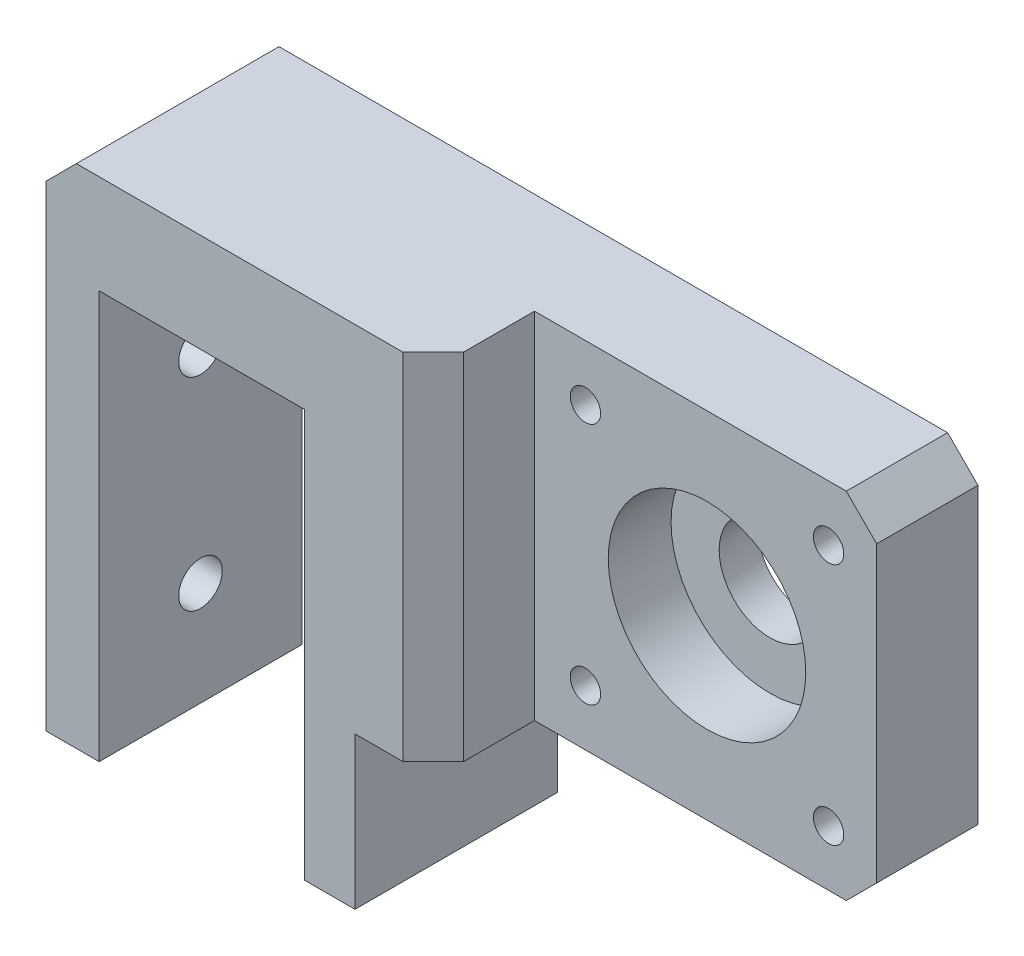
ISO-10303-21;
HEADER;
FILE_DESCRIPTION(('STEP AP214'),'2;1');
FILE_NAME('part.step','',(''),(''),'','','');
FILE_SCHEMA(('AUTOMOTIVE_DESIGN { 1 0 10303 214 1 1 1 1 }'));
ENDSEC;
DATA;
#1=APPLICATION_CONTEXT('core data for automotive mechanical design processes');
#2=APPLICATION_PROTOCOL_DEFINITION('international standard','automotive_design',2000,#1);
#3=PRODUCT_CONTEXT('',#1,'mechanical');
#4=PRODUCT('Part','Part','',(#3));
#5=PRODUCT_RELATED_PRODUCT_CATEGORY('part','',(#4));
#6=PRODUCT_DEFINITION_FORMATION('','',#4);
#7=PRODUCT_DEFINITION_CONTEXT('part definition',#1,'design');
#8=PRODUCT_DEFINITION('design','',#6,#7);
#9=PRODUCT_DEFINITION_SHAPE('','',#8);
#10=(LENGTH_UNIT() NAMED_UNIT(*) SI_UNIT(.MILLI.,.METRE.));
#11=(NAMED_UNIT(*) PLANE_ANGLE_UNIT() SI_UNIT($,.RADIAN.));
#12=(NAMED_UNIT(*) SI_UNIT($,.STERADIAN.) SOLID_ANGLE_UNIT());
#13=UNCERTAINTY_MEASURE_WITH_UNIT(LENGTH_MEASURE(1.E-05),#10,'distance_accuracy_value','');
#14=(GEOMETRIC_REPRESENTATION_CONTEXT(3) GLOBAL_UNCERTAINTY_ASSIGNED_CONTEXT((#13)) GLOBAL_UNIT_ASSIGNED_CONTEXT((#10,
#11,#12)) REPRESENTATION_CONTEXT('',''));
#15=CARTESIAN_POINT('',(0.,0.,0.));
#16=DIRECTION('',(0.,0.,1.));
#17=DIRECTION('',(1.,0.,0.));
#18=AXIS2_PLACEMENT_3D('',#15,#16,#17);
#19=CARTESIAN_POINT('',(55.25,32.5,20.));
#20=DIRECTION('',(0.,0.,1.));
#21=DIRECTION('',(-1.,0.,0.));
#22=AXIS2_PLACEMENT_3D('',#19,#20,#21);
#23=CYLINDRICAL_SURFACE('',#22,5.);
#24=CARTESIAN_POINT('',(55.25,32.5,20.));
#25=DIRECTION('',(0.,0.,1.));
#26=DIRECTION('',(1.,0.,0.));
#27=AXIS2_PLACEMENT_3D('',#24,#25,#26);
#28=CIRCLE('',#27,5.);
#29=CARTESIAN_POINT('',(60.25,32.5,20.));
#30=VERTEX_POINT('',#29);
#31=EDGE_CURVE('E283',#30,#30,#28,.T.);
#32=ORIENTED_EDGE('',*,*,#31,.F.);
#33=EDGE_LOOP('',(#32));
#34=FACE_BOUND('',#33,.T.);
#35=CARTESIAN_POINT('',(55.25,32.5,23.8));
#36=DIRECTION('',(0.,0.,-1.));
#37=DIRECTION('',(-1.,0.,0.));
#38=AXIS2_PLACEMENT_3D('',#35,#36,#37);
#39=CIRCLE('',#38,5.);
#40=CARTESIAN_POINT('',(50.25,32.5,23.8));
#41=VERTEX_POINT('',#40);
#42=EDGE_CURVE('E211',#41,#41,#39,.T.);
#43=ORIENTED_EDGE('',*,*,#42,.F.);
#44=EDGE_LOOP('',(#43));
#45=FACE_BOUND('',#44,.T.);
#46=ADVANCED_FACE('F45',(#34,#45),#23,.F.);
#47=CARTESIAN_POINT('',(72.,50.,20.));
#48=DIRECTION('',(-1.,0.,0.));
#49=DIRECTION('',(0.,0.,-1.));
#50=AXIS2_PLACEMENT_3D('',#47,#48,#49);
#51=PLANE('',#50);
#52=DIRECTION('',(0.,1.,0.));
#53=VECTOR('',#52,1.);
#54=CARTESIAN_POINT('',(72.,50.,20.));
#55=LINE('',#54,#53);
#56=CARTESIAN_POINT('',(72.,18.,20.));
#57=VERTEX_POINT('',#56);
#58=CARTESIAN_POINT('',(72.,47.,20.));
#59=VERTEX_POINT('',#58);
#60=EDGE_CURVE('E302',#57,#59,#55,.T.);
#61=ORIENTED_EDGE('',*,*,#60,.T.);
#62=DIRECTION('',(0.,0.,-1.));
#63=VECTOR('',#62,1.);
#64=CARTESIAN_POINT('',(72.,47.,20.));
#65=LINE('',#64,#63);
#66=CARTESIAN_POINT('',(72.,46.9999999999999,30.));
#67=VERTEX_POINT('',#66);
#68=EDGE_CURVE('E397',#67,#59,#65,.T.);
#69=ORIENTED_EDGE('',*,*,#68,.F.);
#70=DIRECTION('',(0.,-1.,0.));
#71=VECTOR('',#70,1.);
#72=CARTESIAN_POINT('',(72.,50.,30.));
#73=LINE('',#72,#71);
#74=CARTESIAN_POINT('',(72.,18.,30.));
#75=VERTEX_POINT('',#74);
#76=EDGE_CURVE('E215',#67,#75,#73,.T.);
#77=ORIENTED_EDGE('',*,*,#76,.T.);
#78=DIRECTION('',(0.,0.,1.));
#79=VECTOR('',#78,1.);
#80=CARTESIAN_POINT('',(72.,18.,20.));
#81=LINE('',#80,#79);
#82=EDGE_CURVE('E401',#57,#75,#81,.T.);
#83=ORIENTED_EDGE('',*,*,#82,.F.);
#84=EDGE_LOOP('',(#61,#69,#77,#83));
#85=FACE_BOUND('',#84,.T.);
#86=ADVANCED_FACE('F415',(#85),#51,.F.);
#87=CARTESIAN_POINT('',(67.25,44.5,20.));
#88=DIRECTION('',(0.,0.,1.));
#89=DIRECTION('',(-1.,0.,0.));
#90=AXIS2_PLACEMENT_3D('',#87,#88,#89);
#91=CYLINDRICAL_SURFACE('',#90,1.5);
#92=CARTESIAN_POINT('',(67.25,44.5,20.));
#93=DIRECTION('',(0.,0.,1.));
#94=DIRECTION('',(1.,0.,0.));
#95=AXIS2_PLACEMENT_3D('',#92,#93,#94);
#96=CIRCLE('',#95,1.5);
#97=CARTESIAN_POINT('',(68.75,44.5,20.));
#98=VERTEX_POINT('',#97);
#99=EDGE_CURVE('E279',#98,#98,#96,.T.);
#100=ORIENTED_EDGE('',*,*,#99,.F.);
#101=EDGE_LOOP('',(#100));
#102=FACE_BOUND('',#101,.T.);
#103=CARTESIAN_POINT('',(67.25,44.5,30.));
#104=DIRECTION('',(0.,0.,-1.));
#105=DIRECTION('',(-1.,0.,0.));
#106=AXIS2_PLACEMENT_3D('',#103,#104,#105);
#107=CIRCLE('',#106,1.5);
#108=CARTESIAN_POINT('',(65.75,44.5,30.));
#109=VERTEX_POINT('',#108);
#110=EDGE_CURVE('E247',#109,#109,#107,.T.);
#111=ORIENTED_EDGE('',*,*,#110,.F.);
#112=EDGE_LOOP('',(#111));
#113=FACE_BOUND('',#112,.T.);
#114=ADVANCED_FACE('F450',(#102,#113),#91,.F.);
#115=CARTESIAN_POINT('',(43.25,44.5,20.));
#116=DIRECTION('',(0.,0.,1.));
#117=DIRECTION('',(-1.,0.,0.));
#118=AXIS2_PLACEMENT_3D('',#115,#116,#117);
#119=CYLINDRICAL_SURFACE('',#118,1.5);
#120=CARTESIAN_POINT('',(43.25,44.5,20.));
#121=DIRECTION('',(0.,0.,1.));
#122=DIRECTION('',(1.,0.,0.));
#123=AXIS2_PLACEMENT_3D('',#120,#121,#122);
#124=CIRCLE('',#123,1.5);
#125=CARTESIAN_POINT('',(44.75,44.5,20.));
#126=VERTEX_POINT('',#125);
#127=EDGE_CURVE('E275',#126,#126,#124,.T.);
#128=ORIENTED_EDGE('',*,*,#127,.F.);
#129=EDGE_LOOP('',(#128));
#130=FACE_BOUND('',#129,.T.);
#131=CARTESIAN_POINT('',(43.25,44.5,30.));
#132=DIRECTION('',(0.,0.,-1.));
#133=DIRECTION('',(-1.,0.,0.));
#134=AXIS2_PLACEMENT_3D('',#131,#132,#133);
#135=CIRCLE('',#134,1.5);
#136=CARTESIAN_POINT('',(41.75,44.5,30.));
#137=VERTEX_POINT('',#136);
#138=EDGE_CURVE('E243',#137,#137,#135,.T.);
#139=ORIENTED_EDGE('',*,*,#138,.F.);
#140=EDGE_LOOP('',(#139));
#141=FACE_BOUND('',#140,.T.);
#142=ADVANCED_FACE('F541',(#130,#141),#119,.F.);
#143=CARTESIAN_POINT('',(43.25,20.5,20.));
#144=DIRECTION('',(0.,0.,1.));
#145=DIRECTION('',(-1.,0.,0.));
#146=AXIS2_PLACEMENT_3D('',#143,#144,#145);
#147=CYLINDRICAL_SURFACE('',#146,1.5);
#148=CARTESIAN_POINT('',(43.25,20.5,20.));
#149=DIRECTION('',(0.,0.,1.));
#150=DIRECTION('',(1.,0.,0.));
#151=AXIS2_PLACEMENT_3D('',#148,#149,#150);
#152=CIRCLE('',#151,1.5);
#153=CARTESIAN_POINT('',(44.75,20.5,20.));
#154=VERTEX_POINT('',#153);
#155=EDGE_CURVE('E271',#154,#154,#152,.T.);
#156=ORIENTED_EDGE('',*,*,#155,.F.);
#157=EDGE_LOOP('',(#156));
#158=FACE_BOUND('',#157,.T.);
#159=CARTESIAN_POINT('',(43.25,20.5,30.));
#160=DIRECTION('',(0.,0.,-1.));
#161=DIRECTION('',(-1.,0.,0.));
#162=AXIS2_PLACEMENT_3D('',#159,#160,#161);
#163=CIRCLE('',#162,1.5);
#164=CARTESIAN_POINT('',(41.75,20.5,30.));
#165=VERTEX_POINT('',#164);
#166=EDGE_CURVE('E239',#165,#165,#163,.T.);
#167=ORIENTED_EDGE('',*,*,#166,.F.);
#168=EDGE_LOOP('',(#167));
#169=FACE_BOUND('',#168,.T.);
#170=ADVANCED_FACE('F538',(#158,#169),#147,.F.);
#171=CARTESIAN_POINT('',(67.25,20.5,20.));
#172=DIRECTION('',(0.,0.,1.));
#173=DIRECTION('',(-1.,0.,0.));
#174=AXIS2_PLACEMENT_3D('',#171,#172,#173);
#175=CYLINDRICAL_SURFACE('',#174,1.5);
#176=CARTESIAN_POINT('',(67.25,20.5,20.));
#177=DIRECTION('',(0.,0.,1.));
#178=DIRECTION('',(1.,0.,0.));
#179=AXIS2_PLACEMENT_3D('',#176,#177,#178);
#180=CIRCLE('',#179,1.5);
#181=CARTESIAN_POINT('',(68.75,20.5,20.));
#182=VERTEX_POINT('',#181);
#183=EDGE_CURVE('E264',#182,#182,#180,.T.);
#184=ORIENTED_EDGE('',*,*,#183,.F.);
#185=EDGE_LOOP('',(#184));
#186=FACE_BOUND('',#185,.T.);
#187=CARTESIAN_POINT('',(67.25,20.5,30.));
#188=DIRECTION('',(0.,0.,-1.));
#189=DIRECTION('',(-1.,0.,0.));
#190=AXIS2_PLACEMENT_3D('',#187,#188,#189);
#191=CIRCLE('',#190,1.5);
#192=CARTESIAN_POINT('',(65.75,20.5,30.));
#193=VERTEX_POINT('',#192);
#194=EDGE_CURVE('E235',#193,#193,#191,.T.);
#195=ORIENTED_EDGE('',*,*,#194,.F.);
#196=EDGE_LOOP('',(#195));
#197=FACE_BOUND('',#196,.T.);
#198=ADVANCED_FACE('F460',(#186,#197),#175,.F.);
#199=CARTESIAN_POINT('',(0.,0.,20.));
#200=DIRECTION('',(0.,0.,1.));
#201=DIRECTION('',(-1.,0.,0.));
#202=AXIS2_PLACEMENT_3D('',#199,#200,#201);
#203=PLANE('',#202);
#204=DIRECTION('',(-1.,0.,0.));
#205=VECTOR('',#204,1.);
#206=CARTESIAN_POINT('',(0.,50.,20.));
#207=LINE('',#206,#205);
#208=CARTESIAN_POINT('',(68.9999999999999,50.,20.));
#209=VERTEX_POINT('',#208);
#210=CARTESIAN_POINT('',(3.,50.,20.));
#211=VERTEX_POINT('',#210);
#212=EDGE_CURVE('E306',#209,#211,#207,.T.);
#213=ORIENTED_EDGE('',*,*,#212,.F.);
#214=DIRECTION('',(0.707106781186546,-0.707106781186549,0.));
#215=VECTOR('',#214,1.);
#216=CARTESIAN_POINT('',(68.9999999999999,50.,20.));
#217=LINE('',#216,#215);
#218=EDGE_CURVE('E376',#59,#209,#217,.F.);
#219=ORIENTED_EDGE('',*,*,#218,.F.);
#220=ORIENTED_EDGE('',*,*,#60,.F.);
#221=DIRECTION('',(-0.707106781186548,-0.707106781186548,0.));
#222=VECTOR('',#221,1.);
#223=CARTESIAN_POINT('',(72.,18.,20.));
#224=LINE('',#223,#222);
#225=CARTESIAN_POINT('',(69.,15.,20.));
#226=VERTEX_POINT('',#225);
#227=EDGE_CURVE('E380',#226,#57,#224,.F.);
#228=ORIENTED_EDGE('',*,*,#227,.F.);
#229=DIRECTION('',(1.,0.,0.));
#230=VECTOR('',#229,1.);
#231=CARTESIAN_POINT('',(72.,15.,20.));
#232=LINE('',#231,#230);
#233=CARTESIAN_POINT('',(30.5,15.,20.));
#234=VERTEX_POINT('',#233);
#235=EDGE_CURVE('E298',#234,#226,#232,.T.);
#236=ORIENTED_EDGE('',*,*,#235,.F.);
#237=DIRECTION('',(0.,1.,0.));
#238=VECTOR('',#237,1.);
#239=CARTESIAN_POINT('',(30.5,15.,20.));
#240=LINE('',#239,#238);
#241=CARTESIAN_POINT('',(30.5,0.,20.));
#242=VERTEX_POINT('',#241);
#243=EDGE_CURVE('E294',#242,#234,#240,.T.);
#244=ORIENTED_EDGE('',*,*,#243,.F.);
#245=DIRECTION('',(1.,0.,0.));
#246=VECTOR('',#245,1.);
#247=CARTESIAN_POINT('',(30.5,0.,20.));
#248=LINE('',#247,#246);
#249=CARTESIAN_POINT('',(25.5,0.,20.));
#250=VERTEX_POINT('',#249);
#251=EDGE_CURVE('E290',#250,#242,#248,.T.);
#252=ORIENTED_EDGE('',*,*,#251,.F.);
#253=DIRECTION('',(0.,-1.,0.));
#254=VECTOR('',#253,1.);
#255=CARTESIAN_POINT('',(25.5,40.5,20.));
#256=LINE('',#255,#254);
#257=CARTESIAN_POINT('',(25.5,40.25,20.));
#258=VERTEX_POINT('',#257);
#259=EDGE_CURVE('E167',#258,#250,#256,.T.);
#260=ORIENTED_EDGE('',*,*,#259,.F.);
#261=DIRECTION('',(1.,0.,0.));
#262=VECTOR('',#261,1.);
#263=CARTESIAN_POINT('',(5.,40.25,20.));
#264=LINE('',#263,#262);
#265=CARTESIAN_POINT('',(5.25000000000003,40.25,20.));
#266=VERTEX_POINT('',#265);
#267=EDGE_CURVE('E176',#266,#258,#264,.T.);
#268=ORIENTED_EDGE('',*,*,#267,.F.);
#269=DIRECTION('',(0.,1.,0.));
#270=VECTOR('',#269,1.);
#271=CARTESIAN_POINT('',(5.24999999999998,0.,20.));
#272=LINE('',#271,#270);
#273=CARTESIAN_POINT('',(5.24999999999998,0.,20.));
#274=VERTEX_POINT('',#273);
#275=EDGE_CURVE('E171',#274,#266,#272,.T.);
#276=ORIENTED_EDGE('',*,*,#275,.F.);
#277=DIRECTION('',(1.,0.,0.));
#278=VECTOR('',#277,1.);
#279=CARTESIAN_POINT('',(5.,0.,20.));
#280=LINE('',#279,#278);
#281=CARTESIAN_POINT('',(0.,0.,20.));
#282=VERTEX_POINT('',#281);
#283=EDGE_CURVE('E156',#282,#274,#280,.T.);
#284=ORIENTED_EDGE('',*,*,#283,.F.);
#285=DIRECTION('',(0.,-1.,0.));
#286=VECTOR('',#285,1.);
#287=CARTESIAN_POINT('',(0.,0.,20.));
#288=LINE('',#287,#286);
#289=CARTESIAN_POINT('',(0.,47.,20.));
#290=VERTEX_POINT('',#289);
#291=EDGE_CURVE('E310',#290,#282,#288,.T.);
#292=ORIENTED_EDGE('',*,*,#291,.F.);
#293=DIRECTION('',(0.707106781186549,0.707106781186546,0.));
#294=VECTOR('',#293,1.);
#295=CARTESIAN_POINT('',(0.,47.,20.));
#296=LINE('',#295,#294);
#297=EDGE_CURVE('E383',#211,#290,#296,.F.);
#298=ORIENTED_EDGE('',*,*,#297,.F.);
#299=EDGE_LOOP('',(#213,#219,#220,#228,#236,#244,#252,#260,#268,#276,#284,#292,#298));
#300=FACE_BOUND('',#299,.T.);
#301=ORIENTED_EDGE('',*,*,#31,.T.);
#302=EDGE_LOOP('',(#301));
#303=FACE_BOUND('',#302,.T.);
#304=ORIENTED_EDGE('',*,*,#99,.T.);
#305=EDGE_LOOP('',(#304));
#306=FACE_BOUND('',#305,.T.);
#307=ORIENTED_EDGE('',*,*,#127,.T.);
#308=EDGE_LOOP('',(#307));
#309=FACE_BOUND('',#308,.T.);
#310=ORIENTED_EDGE('',*,*,#155,.T.);
#311=EDGE_LOOP('',(#310));
#312=FACE_BOUND('',#311,.T.);
#313=ORIENTED_EDGE('',*,*,#183,.T.);
#314=EDGE_LOOP('',(#313));
#315=FACE_BOUND('',#314,.T.);
#316=ADVANCED_FACE('F173',(#300,#303,#306,#309,#312,#315),#203,.F.);
#317=CARTESIAN_POINT('',(0.,0.,40.));
#318=DIRECTION('',(0.,0.,1.));
#319=DIRECTION('',(-1.,0.,0.));
#320=AXIS2_PLACEMENT_3D('',#317,#318,#319);
#321=PLANE('',#320);
#322=DIRECTION('',(0.,-1.,0.));
#323=VECTOR('',#322,1.);
#324=CARTESIAN_POINT('',(0.,0.,40.));
#325=LINE('',#324,#323);
#326=CARTESIAN_POINT('',(0.,47.,40.));
#327=VERTEX_POINT('',#326);
#328=CARTESIAN_POINT('',(0.,0.,40.));
#329=VERTEX_POINT('',#328);
#330=EDGE_CURVE('E168',#327,#329,#325,.T.);
#331=ORIENTED_EDGE('',*,*,#330,.T.);
#332=DIRECTION('',(1.,0.,0.));
#333=VECTOR('',#332,1.);
#334=CARTESIAN_POINT('',(4.99999999999995,0.,40.));
#335=LINE('',#334,#333);
#336=CARTESIAN_POINT('',(5.24999999999998,0.,40.));
#337=VERTEX_POINT('',#336);
#338=EDGE_CURVE('E286',#329,#337,#335,.T.);
#339=ORIENTED_EDGE('',*,*,#338,.T.);
#340=DIRECTION('',(0.,-1.,0.));
#341=VECTOR('',#340,1.);
#342=CARTESIAN_POINT('',(5.24999999999998,40.25,40.));
#343=LINE('',#342,#341);
#344=CARTESIAN_POINT('',(5.24999999999998,40.25,40.));
#345=VERTEX_POINT('',#344);
#346=EDGE_CURVE('E184',#345,#337,#343,.T.);
#347=ORIENTED_EDGE('',*,*,#346,.F.);
#348=DIRECTION('',(-1.,0.,0.));
#349=VECTOR('',#348,1.);
#350=CARTESIAN_POINT('',(25.5,40.25,40.));
#351=LINE('',#350,#349);
#352=CARTESIAN_POINT('',(25.5,40.25,40.));
#353=VERTEX_POINT('',#352);
#354=EDGE_CURVE('E66',#353,#345,#351,.T.);
#355=ORIENTED_EDGE('',*,*,#354,.F.);
#356=DIRECTION('',(0.,-1.,0.));
#357=VECTOR('',#356,1.);
#358=CARTESIAN_POINT('',(25.5,40.5,40.));
#359=LINE('',#358,#357);
#360=CARTESIAN_POINT('',(25.5,0.,40.));
#361=VERTEX_POINT('',#360);
#362=EDGE_CURVE('E315',#353,#361,#359,.T.);
#363=ORIENTED_EDGE('',*,*,#362,.T.);
#364=DIRECTION('',(1.,0.,0.));
#365=VECTOR('',#364,1.);
#366=CARTESIAN_POINT('',(30.5,0.,40.));
#367=LINE('',#366,#365);
#368=CARTESIAN_POINT('',(30.5,0.,40.));
#369=VERTEX_POINT('',#368);
#370=EDGE_CURVE('E318',#361,#369,#367,.T.);
#371=ORIENTED_EDGE('',*,*,#370,.T.);
#372=DIRECTION('',(0.,1.,0.));
#373=VECTOR('',#372,1.);
#374=CARTESIAN_POINT('',(30.5,15.,40.));
#375=LINE('',#374,#373);
#376=CARTESIAN_POINT('',(30.5,15.,40.));
#377=VERTEX_POINT('',#376);
#378=EDGE_CURVE('E322',#369,#377,#375,.T.);
#379=ORIENTED_EDGE('',*,*,#378,.T.);
#380=DIRECTION('',(1.,0.,0.));
#381=VECTOR('',#380,1.);
#382=CARTESIAN_POINT('',(72.,15.,40.));
#383=LINE('',#382,#381);
#384=CARTESIAN_POINT('',(35.2227335597846,15.,40.));
#385=VERTEX_POINT('',#384);
#386=EDGE_CURVE('E326',#377,#385,#383,.T.);
#387=ORIENTED_EDGE('',*,*,#386,.T.);
#388=DIRECTION('',(0.,-1.,0.));
#389=VECTOR('',#388,1.);
#390=CARTESIAN_POINT('',(35.2227335597846,15.,40.));
#391=LINE('',#390,#389);
#392=CARTESIAN_POINT('',(35.2227335597846,50.,40.));
#393=VERTEX_POINT('',#392);
#394=EDGE_CURVE('E358',#393,#385,#391,.T.);
#395=ORIENTED_EDGE('',*,*,#394,.F.);
#396=DIRECTION('',(-1.,0.,0.));
#397=VECTOR('',#396,1.);
#398=CARTESIAN_POINT('',(0.,50.,40.));
#399=LINE('',#398,#397);
#400=CARTESIAN_POINT('',(3.,50.,40.));
#401=VERTEX_POINT('',#400);
#402=EDGE_CURVE('E330',#393,#401,#399,.T.);
#403=ORIENTED_EDGE('',*,*,#402,.T.);
#404=DIRECTION('',(-0.707106781186549,-0.707106781186546,0.));
#405=VECTOR('',#404,1.);
#406=CARTESIAN_POINT('',(-23.5,23.5000000000001,40.));
#407=LINE('',#406,#405);
#408=EDGE_CURVE('E362',#327,#401,#407,.F.);
#409=ORIENTED_EDGE('',*,*,#408,.F.);
#410=EDGE_LOOP('',(#331,#339,#347,#355,#363,#371,#379,#387,#395,#403,#409));
#411=FACE_BOUND('',#410,.T.);
#412=ADVANCED_FACE('F459',(#411),#321,.T.);
#413=CARTESIAN_POINT('',(5.,0.,20.));
#414=DIRECTION('',(0.,1.,0.));
#415=DIRECTION('',(-1.,0.,0.));
#416=AXIS2_PLACEMENT_3D('',#413,#414,#415);
#417=PLANE('',#416);
#418=ORIENTED_EDGE('',*,*,#338,.F.);
#419=DIRECTION('',(0.,0.,1.));
#420=VECTOR('',#419,1.);
#421=CARTESIAN_POINT('',(0.,0.,20.));
#422=LINE('',#421,#420);
#423=EDGE_CURVE('E162',#282,#329,#422,.T.);
#424=ORIENTED_EDGE('',*,*,#423,.F.);
#425=ORIENTED_EDGE('',*,*,#283,.T.);
#426=DIRECTION('',(0.,0.,-1.));
#427=VECTOR('',#426,1.);
#428=CARTESIAN_POINT('',(5.24999999999998,0.,40.));
#429=LINE('',#428,#427);
#430=EDGE_CURVE('E161',#337,#274,#429,.T.);
#431=ORIENTED_EDGE('',*,*,#430,.F.);
#432=EDGE_LOOP('',(#418,#424,#425,#431));
#433=FACE_BOUND('',#432,.T.);
#434=ADVANCED_FACE('F159',(#433),#417,.F.);
#435=CARTESIAN_POINT('',(25.5,40.5,20.));
#436=DIRECTION('',(1.,0.,0.));
#437=DIRECTION('',(0.,1.,0.));
#438=AXIS2_PLACEMENT_3D('',#435,#436,#437);
#439=PLANE('',#438);
#440=CARTESIAN_POINT('',(25.5,10.25,30.));
#441=DIRECTION('',(-1.,0.,0.));
#442=DIRECTION('',(0.,1.,0.));
#443=AXIS2_PLACEMENT_3D('',#440,#441,#442);
#444=CIRCLE('',#443,2.15000000000001);
#445=CARTESIAN_POINT('',(25.5,12.4,30.));
#446=VERTEX_POINT('',#445);
#447=EDGE_CURVE('E255',#446,#446,#444,.T.);
#448=ORIENTED_EDGE('',*,*,#447,.F.);
#449=EDGE_LOOP('',(#448));
#450=FACE_BOUND('',#449,.T.);
#451=ORIENTED_EDGE('',*,*,#362,.F.);
#452=DIRECTION('',(0.,0.,1.));
#453=VECTOR('',#452,1.);
#454=CARTESIAN_POINT('',(25.5,40.25,20.));
#455=LINE('',#454,#453);
#456=EDGE_CURVE('E199',#258,#353,#455,.T.);
#457=ORIENTED_EDGE('',*,*,#456,.F.);
#458=ORIENTED_EDGE('',*,*,#259,.T.);
#459=DIRECTION('',(0.,0.,1.));
#460=VECTOR('',#459,1.);
#461=CARTESIAN_POINT('',(25.5,0.,20.));
#462=LINE('',#461,#460);
#463=EDGE_CURVE('E345',#250,#361,#462,.T.);
#464=ORIENTED_EDGE('',*,*,#463,.T.);
#465=EDGE_LOOP('',(#451,#457,#458,#464));
#466=FACE_BOUND('',#465,.T.);
#467=ADVANCED_FACE('F480',(#450,#466),#439,.F.);
#468=CARTESIAN_POINT('',(30.5,0.,20.));
#469=DIRECTION('',(0.,1.,0.));
#470=DIRECTION('',(-1.,0.,0.));
#471=AXIS2_PLACEMENT_3D('',#468,#469,#470);
#472=PLANE('',#471);
#473=ORIENTED_EDGE('',*,*,#370,.F.);
#474=ORIENTED_EDGE('',*,*,#463,.F.);
#475=ORIENTED_EDGE('',*,*,#251,.T.);
#476=DIRECTION('',(0.,0.,1.));
#477=VECTOR('',#476,1.);
#478=CARTESIAN_POINT('',(30.5,0.,20.));
#479=LINE('',#478,#477);
#480=EDGE_CURVE('E342',#242,#369,#479,.T.);
#481=ORIENTED_EDGE('',*,*,#480,.T.);
#482=EDGE_LOOP('',(#473,#474,#475,#481));
#483=FACE_BOUND('',#482,.T.);
#484=ADVANCED_FACE('F476',(#483),#472,.F.);
#485=CARTESIAN_POINT('',(30.5,15.,20.));
#486=DIRECTION('',(-1.,0.,0.));
#487=DIRECTION('',(0.,-1.,0.));
#488=AXIS2_PLACEMENT_3D('',#485,#486,#487);
#489=PLANE('',#488);
#490=CARTESIAN_POINT('',(30.5,10.25,30.));
#491=DIRECTION('',(-1.,0.,0.));
#492=DIRECTION('',(0.,1.,0.));
#493=AXIS2_PLACEMENT_3D('',#490,#491,#492);
#494=CIRCLE('',#493,2.15000000000001);
#495=CARTESIAN_POINT('',(30.5,12.4,30.));
#496=VERTEX_POINT('',#495);
#497=EDGE_CURVE('E251',#496,#496,#494,.T.);
#498=ORIENTED_EDGE('',*,*,#497,.T.);
#499=EDGE_LOOP('',(#498));
#500=FACE_BOUND('',#499,.T.);
#501=ORIENTED_EDGE('',*,*,#378,.F.);
#502=ORIENTED_EDGE('',*,*,#480,.F.);
#503=ORIENTED_EDGE('',*,*,#243,.T.);
#504=DIRECTION('',(0.,0.,1.));
#505=VECTOR('',#504,1.);
#506=CARTESIAN_POINT('',(30.5,15.,20.));
#507=LINE('',#506,#505);
#508=EDGE_CURVE('E339',#234,#377,#507,.T.);
#509=ORIENTED_EDGE('',*,*,#508,.T.);
#510=EDGE_LOOP('',(#501,#502,#503,#509));
#511=FACE_BOUND('',#510,.T.);
#512=ADVANCED_FACE('F473',(#500,#511),#489,.F.);
#513=CARTESIAN_POINT('',(72.,15.,20.));
#514=DIRECTION('',(0.,1.,0.));
#515=DIRECTION('',(-1.,0.,0.));
#516=AXIS2_PLACEMENT_3D('',#513,#514,#515);
#517=PLANE('',#516);
#518=ORIENTED_EDGE('',*,*,#386,.F.);
#519=ORIENTED_EDGE('',*,*,#508,.F.);
#520=ORIENTED_EDGE('',*,*,#235,.T.);
#521=DIRECTION('',(0.,0.,-1.));
#522=VECTOR('',#521,1.);
#523=CARTESIAN_POINT('',(69.,15.,20.));
#524=LINE('',#523,#522);
#525=CARTESIAN_POINT('',(69.,15.,30.));
#526=VERTEX_POINT('',#525);
#527=EDGE_CURVE('E390',#526,#226,#524,.T.);
#528=ORIENTED_EDGE('',*,*,#527,.F.);
#529=DIRECTION('',(-1.,0.,0.));
#530=VECTOR('',#529,1.);
#531=CARTESIAN_POINT('',(72.,15.,30.));
#532=LINE('',#531,#530);
#533=CARTESIAN_POINT('',(38.2227335597846,15.,30.));
#534=VERTEX_POINT('',#533);
#535=EDGE_CURVE('E219',#526,#534,#532,.T.);
#536=ORIENTED_EDGE('',*,*,#535,.T.);
#537=DIRECTION('',(0.,0.,1.));
#538=VECTOR('',#537,1.);
#539=CARTESIAN_POINT('',(38.2227335597846,15.,30.));
#540=LINE('',#539,#538);
#541=CARTESIAN_POINT('',(38.2227335597847,15.,37.));
#542=VERTEX_POINT('',#541);
#543=EDGE_CURVE('E230',#534,#542,#540,.T.);
#544=ORIENTED_EDGE('',*,*,#543,.T.);
#545=DIRECTION('',(0.707106781186548,0.,-0.707106781186548));
#546=VECTOR('',#545,1.);
#547=CARTESIAN_POINT('',(38.2227335597847,15.,37.));
#548=LINE('',#547,#546);
#549=EDGE_CURVE('E393',#385,#542,#548,.T.);
#550=ORIENTED_EDGE('',*,*,#549,.F.);
#551=EDGE_LOOP('',(#518,#519,#520,#528,#536,#544,#550));
#552=FACE_BOUND('',#551,.T.);
#553=ADVANCED_FACE('F431',(#552),#517,.F.);
#554=CARTESIAN_POINT('',(0.,50.,20.));
#555=DIRECTION('',(0.,-1.,0.));
#556=DIRECTION('',(0.,0.,1.));
#557=AXIS2_PLACEMENT_3D('',#554,#555,#556);
#558=PLANE('',#557);
#559=ORIENTED_EDGE('',*,*,#402,.F.);
#560=DIRECTION('',(-0.707106781186548,0.,0.707106781186548));
#561=VECTOR('',#560,1.);
#562=CARTESIAN_POINT('',(38.2227335597846,50.,37.));
#563=LINE('',#562,#561);
#564=CARTESIAN_POINT('',(38.2227335597846,50.,37.));
#565=VERTEX_POINT('',#564);
#566=EDGE_CURVE('E370',#565,#393,#563,.T.);
#567=ORIENTED_EDGE('',*,*,#566,.F.);
#568=DIRECTION('',(0.,0.,1.));
#569=VECTOR('',#568,1.);
#570=CARTESIAN_POINT('',(38.2227335597846,50.,30.));
#571=LINE('',#570,#569);
#572=CARTESIAN_POINT('',(38.2227335597846,50.,30.));
#573=VERTEX_POINT('',#572);
#574=EDGE_CURVE('E231',#573,#565,#571,.T.);
#575=ORIENTED_EDGE('',*,*,#574,.F.);
#576=DIRECTION('',(1.,0.,0.));
#577=VECTOR('',#576,1.);
#578=CARTESIAN_POINT('',(72.,50.,30.));
#579=LINE('',#578,#577);
#580=CARTESIAN_POINT('',(68.9999999999999,50.,30.));
#581=VERTEX_POINT('',#580);
#582=EDGE_CURVE('E226',#573,#581,#579,.T.);
#583=ORIENTED_EDGE('',*,*,#582,.T.);
#584=DIRECTION('',(0.,0.,1.));
#585=VECTOR('',#584,1.);
#586=CARTESIAN_POINT('',(68.9999999999999,50.,20.));
#587=LINE('',#586,#585);
#588=EDGE_CURVE('E366',#209,#581,#587,.T.);
#589=ORIENTED_EDGE('',*,*,#588,.F.);
#590=ORIENTED_EDGE('',*,*,#212,.T.);
#591=DIRECTION('',(0.,0.,-1.));
#592=VECTOR('',#591,1.);
#593=CARTESIAN_POINT('',(3.,50.,20.));
#594=LINE('',#593,#592);
#595=EDGE_CURVE('E373',#401,#211,#594,.T.);
#596=ORIENTED_EDGE('',*,*,#595,.F.);
#597=EDGE_LOOP('',(#559,#567,#575,#583,#589,#590,#596));
#598=FACE_BOUND('',#597,.T.);
#599=ADVANCED_FACE('F422',(#598),#558,.F.);
#600=CARTESIAN_POINT('',(0.,0.,20.));
#601=DIRECTION('',(1.,0.,0.));
#602=DIRECTION('',(0.,0.,1.));
#603=AXIS2_PLACEMENT_3D('',#600,#601,#602);
#604=PLANE('',#603);
#605=CARTESIAN_POINT('',(0.,10.25,30.));
#606=DIRECTION('',(1.,0.,0.));
#607=DIRECTION('',(0.,0.,-1.));
#608=AXIS2_PLACEMENT_3D('',#605,#606,#607);
#609=CIRCLE('',#608,2.15);
#610=CARTESIAN_POINT('',(0.,10.25,27.85));
#611=VERTEX_POINT('',#610);
#612=EDGE_CURVE('E260',#611,#611,#609,.T.);
#613=ORIENTED_EDGE('',*,*,#612,.T.);
#614=EDGE_LOOP('',(#613));
#615=FACE_BOUND('',#614,.T.);
#616=CARTESIAN_POINT('',(0.,30.25,30.));
#617=DIRECTION('',(1.,0.,0.));
#618=DIRECTION('',(0.,0.,-1.));
#619=AXIS2_PLACEMENT_3D('',#616,#617,#618);
#620=CIRCLE('',#619,2.15);
#621=CARTESIAN_POINT('',(0.,30.25,27.85));
#622=VERTEX_POINT('',#621);
#623=EDGE_CURVE('E259',#622,#622,#620,.T.);
#624=ORIENTED_EDGE('',*,*,#623,.T.);
#625=EDGE_LOOP('',(#624));
#626=FACE_BOUND('',#625,.T.);
#627=ORIENTED_EDGE('',*,*,#291,.T.);
#628=ORIENTED_EDGE('',*,*,#423,.T.);
#629=ORIENTED_EDGE('',*,*,#330,.F.);
#630=DIRECTION('',(0.,0.,1.));
#631=VECTOR('',#630,1.);
#632=CARTESIAN_POINT('',(0.,47.,20.));
#633=LINE('',#632,#631);
#634=EDGE_CURVE('E349',#290,#327,#633,.T.);
#635=ORIENTED_EDGE('',*,*,#634,.F.);
#636=EDGE_LOOP('',(#627,#628,#629,#635));
#637=FACE_BOUND('',#636,.T.);
#638=ADVANCED_FACE('F464',(#615,#626,#637),#604,.F.);
#639=CARTESIAN_POINT('',(20.,30.2499999999999,30.));
#640=DIRECTION('',(-1.,0.,0.));
#641=DIRECTION('',(0.,0.,-1.));
#642=AXIS2_PLACEMENT_3D('',#639,#640,#641);
#643=CYLINDRICAL_SURFACE('',#642,2.15);
#644=ORIENTED_EDGE('',*,*,#623,.F.);
#645=EDGE_LOOP('',(#644));
#646=FACE_BOUND('',#645,.T.);
#647=CARTESIAN_POINT('',(5.25000000000003,30.25,30.));
#648=DIRECTION('',(1.,0.,0.));
#649=DIRECTION('',(0.,0.,-1.));
#650=AXIS2_PLACEMENT_3D('',#647,#648,#649);
#651=CIRCLE('',#650,2.15);
#652=CARTESIAN_POINT('',(5.25000000000003,30.25,27.85));
#653=VERTEX_POINT('',#652);
#654=EDGE_CURVE('E191',#653,#653,#651,.T.);
#655=ORIENTED_EDGE('',*,*,#654,.T.);
#656=EDGE_LOOP('',(#655));
#657=FACE_BOUND('',#656,.T.);
#658=ADVANCED_FACE('F467',(#646,#657),#643,.F.);
#659=CARTESIAN_POINT('',(20.,10.25,30.));
#660=DIRECTION('',(-1.,0.,0.));
#661=DIRECTION('',(0.,0.,-1.));
#662=AXIS2_PLACEMENT_3D('',#659,#660,#661);
#663=CYLINDRICAL_SURFACE('',#662,2.15);
#664=ORIENTED_EDGE('',*,*,#612,.F.);
#665=EDGE_LOOP('',(#664));
#666=FACE_BOUND('',#665,.T.);
#667=CARTESIAN_POINT('',(5.24999999999998,10.25,30.));
#668=DIRECTION('',(1.,0.,0.));
#669=DIRECTION('',(0.,0.,-1.));
#670=AXIS2_PLACEMENT_3D('',#667,#668,#669);
#671=CIRCLE('',#670,2.15);
#672=CARTESIAN_POINT('',(5.24999999999998,10.25,27.85));
#673=VERTEX_POINT('',#672);
#674=EDGE_CURVE('E186',#673,#673,#671,.T.);
#675=ORIENTED_EDGE('',*,*,#674,.T.);
#676=EDGE_LOOP('',(#675));
#677=FACE_BOUND('',#676,.T.);
#678=ADVANCED_FACE('F528',(#666,#677),#663,.F.);
#679=CARTESIAN_POINT('',(10.5,10.25,30.));
#680=DIRECTION('',(1.,0.,0.));
#681=DIRECTION('',(0.,1.,0.));
#682=AXIS2_PLACEMENT_3D('',#679,#680,#681);
#683=CYLINDRICAL_SURFACE('',#682,2.15000000000001);
#684=ORIENTED_EDGE('',*,*,#497,.F.);
#685=EDGE_LOOP('',(#684));
#686=FACE_BOUND('',#685,.T.);
#687=ORIENTED_EDGE('',*,*,#447,.T.);
#688=EDGE_LOOP('',(#687));
#689=FACE_BOUND('',#688,.T.);
#690=ADVANCED_FACE('F525',(#686,#689),#683,.F.);
#691=CARTESIAN_POINT('',(38.2227335597846,50.,30.));
#692=DIRECTION('',(-1.,0.,0.));
#693=DIRECTION('',(0.,0.,-1.));
#694=AXIS2_PLACEMENT_3D('',#691,#692,#693);
#695=PLANE('',#694);
#696=ORIENTED_EDGE('',*,*,#543,.F.);
#697=DIRECTION('',(0.,1.,0.));
#698=VECTOR('',#697,1.);
#699=CARTESIAN_POINT('',(38.2227335597846,50.,30.));
#700=LINE('',#699,#698);
#701=EDGE_CURVE('E223',#534,#573,#700,.T.);
#702=ORIENTED_EDGE('',*,*,#701,.T.);
#703=ORIENTED_EDGE('',*,*,#574,.T.);
#704=DIRECTION('',(0.,1.,0.));
#705=VECTOR('',#704,1.);
#706=CARTESIAN_POINT('',(38.2227335597846,50.,37.));
#707=LINE('',#706,#705);
#708=EDGE_CURVE('E387',#542,#565,#707,.T.);
#709=ORIENTED_EDGE('',*,*,#708,.F.);
#710=EDGE_LOOP('',(#696,#702,#703,#709));
#711=FACE_BOUND('',#710,.T.);
#712=ADVANCED_FACE('F428',(#711),#695,.F.);
#713=CARTESIAN_POINT('',(0.,0.,30.));
#714=DIRECTION('',(0.,0.,1.));
#715=DIRECTION('',(-1.,0.,0.));
#716=AXIS2_PLACEMENT_3D('',#713,#714,#715);
#717=PLANE('',#716);
#718=CARTESIAN_POINT('',(55.25,32.5,30.));
#719=DIRECTION('',(0.,0.,-1.));
#720=DIRECTION('',(-1.,0.,0.));
#721=AXIS2_PLACEMENT_3D('',#718,#719,#720);
#722=CIRCLE('',#721,9.75);
#723=CARTESIAN_POINT('',(45.5,32.5,30.));
#724=VERTEX_POINT('',#723);
#725=EDGE_CURVE('E206',#724,#724,#722,.T.);
#726=ORIENTED_EDGE('',*,*,#725,.T.);
#727=EDGE_LOOP('',(#726));
#728=FACE_BOUND('',#727,.T.);
#729=ORIENTED_EDGE('',*,*,#110,.T.);
#730=EDGE_LOOP('',(#729));
#731=FACE_BOUND('',#730,.T.);
#732=ORIENTED_EDGE('',*,*,#138,.T.);
#733=EDGE_LOOP('',(#732));
#734=FACE_BOUND('',#733,.T.);
#735=ORIENTED_EDGE('',*,*,#166,.T.);
#736=EDGE_LOOP('',(#735));
#737=FACE_BOUND('',#736,.T.);
#738=ORIENTED_EDGE('',*,*,#194,.T.);
#739=EDGE_LOOP('',(#738));
#740=FACE_BOUND('',#739,.T.);
#741=ORIENTED_EDGE('',*,*,#76,.F.);
#742=DIRECTION('',(-0.707106781186546,0.707106781186549,0.));
#743=VECTOR('',#742,1.);
#744=CARTESIAN_POINT('',(59.5000000000001,59.4999999999998,30.));
#745=LINE('',#744,#743);
#746=EDGE_CURVE('E54',#581,#67,#745,.F.);
#747=ORIENTED_EDGE('',*,*,#746,.F.);
#748=ORIENTED_EDGE('',*,*,#582,.F.);
#749=ORIENTED_EDGE('',*,*,#701,.F.);
#750=ORIENTED_EDGE('',*,*,#535,.F.);
#751=DIRECTION('',(0.707106781186548,0.707106781186548,0.));
#752=VECTOR('',#751,1.);
#753=CARTESIAN_POINT('',(27.,-27.,30.));
#754=LINE('',#753,#752);
#755=EDGE_CURVE('E11',#75,#526,#754,.F.);
#756=ORIENTED_EDGE('',*,*,#755,.F.);
#757=EDGE_LOOP('',(#741,#747,#748,#749,#750,#756));
#758=FACE_BOUND('',#757,.T.);
#759=ADVANCED_FACE('F411',(#728,#731,#734,#737,#740,#758),#717,.T.);
#760=CARTESIAN_POINT('',(55.25,32.5,23.8));
#761=DIRECTION('',(0.,0.,1.));
#762=DIRECTION('',(-1.,0.,0.));
#763=AXIS2_PLACEMENT_3D('',#760,#761,#762);
#764=CYLINDRICAL_SURFACE('',#763,9.75);
#765=CARTESIAN_POINT('',(55.25,32.5,23.8));
#766=DIRECTION('',(0.,0.,-1.));
#767=DIRECTION('',(-1.,0.,0.));
#768=AXIS2_PLACEMENT_3D('',#765,#766,#767);
#769=CIRCLE('',#768,9.75);
#770=CARTESIAN_POINT('',(45.5,32.5,23.8));
#771=VERTEX_POINT('',#770);
#772=EDGE_CURVE('E207',#771,#771,#769,.T.);
#773=CARTESIAN_POINT('',(45.5,32.5,23.8));
#774=CARTESIAN_POINT('',(45.5,32.5,23.8645833333333));
#775=CARTESIAN_POINT('',(45.5,32.5,23.9291666666667));
#776=CARTESIAN_POINT('',(45.5,32.5,24.0583333333333));
#777=CARTESIAN_POINT('',(45.5,32.5,24.1229166666667));
#778=CARTESIAN_POINT('',(45.5,32.5,24.2520833333333));
#779=CARTESIAN_POINT('',(45.5,32.5,24.3166666666667));
#780=CARTESIAN_POINT('',(45.5,32.5,24.4458333333333));
#781=CARTESIAN_POINT('',(45.5,32.5,24.5104166666667));
#782=CARTESIAN_POINT('',(45.5,32.5,24.6395833333333));
#783=CARTESIAN_POINT('',(45.5,32.5,24.7041666666667));
#784=CARTESIAN_POINT('',(45.5,32.5,24.8333333333333));
#785=CARTESIAN_POINT('',(45.5,32.5,24.8979166666667));
#786=CARTESIAN_POINT('',(45.5,32.5,25.0270833333333));
#787=CARTESIAN_POINT('',(45.5,32.5,25.0916666666667));
#788=CARTESIAN_POINT('',(45.5,32.5,25.2208333333333));
#789=CARTESIAN_POINT('',(45.5,32.5,25.2854166666667));
#790=CARTESIAN_POINT('',(45.5,32.5,25.4145833333333));
#791=CARTESIAN_POINT('',(45.5,32.5,25.4791666666667));
#792=CARTESIAN_POINT('',(45.5,32.5,25.6083333333333));
#793=CARTESIAN_POINT('',(45.5,32.5,25.6729166666667));
#794=CARTESIAN_POINT('',(45.5,32.5,25.8020833333333));
#795=CARTESIAN_POINT('',(45.5,32.5,25.8666666666667));
#796=CARTESIAN_POINT('',(45.5,32.5,25.9958333333333));
#797=CARTESIAN_POINT('',(45.5,32.5,26.0604166666667));
#798=CARTESIAN_POINT('',(45.5,32.5,26.1895833333333));
#799=CARTESIAN_POINT('',(45.5,32.5,26.2541666666667));
#800=CARTESIAN_POINT('',(45.5,32.5,26.3833333333333));
#801=CARTESIAN_POINT('',(45.5,32.5,26.4479166666667));
#802=CARTESIAN_POINT('',(45.5,32.5,26.5770833333333));
#803=CARTESIAN_POINT('',(45.5,32.5,26.6416666666667));
#804=CARTESIAN_POINT('',(45.5,32.5,26.7708333333333));
#805=CARTESIAN_POINT('',(45.5,32.5,26.8354166666667));
#806=CARTESIAN_POINT('',(45.5,32.5,26.9645833333333));
#807=CARTESIAN_POINT('',(45.5,32.5,27.0291666666667));
#808=CARTESIAN_POINT('',(45.5,32.5,27.1583333333333));
#809=CARTESIAN_POINT('',(45.5,32.5,27.2229166666667));
#810=CARTESIAN_POINT('',(45.5,32.5,27.3520833333333));
#811=CARTESIAN_POINT('',(45.5,32.5,27.4166666666667));
#812=CARTESIAN_POINT('',(45.5,32.5,27.5458333333333));
#813=CARTESIAN_POINT('',(45.5,32.5,27.6104166666667));
#814=CARTESIAN_POINT('',(45.5,32.5,27.7395833333333));
#815=CARTESIAN_POINT('',(45.5,32.5,27.8041666666667));
#816=CARTESIAN_POINT('',(45.5,32.5,27.9333333333333));
#817=CARTESIAN_POINT('',(45.5,32.5,27.9979166666667));
#818=CARTESIAN_POINT('',(45.5,32.5,28.1270833333333));
#819=CARTESIAN_POINT('',(45.5,32.5,28.1916666666667));
#820=CARTESIAN_POINT('',(45.5,32.5,28.3208333333333));
#821=CARTESIAN_POINT('',(45.5,32.5,28.3854166666667));
#822=CARTESIAN_POINT('',(45.5,32.5,28.5145833333333));
#823=CARTESIAN_POINT('',(45.5,32.5,28.5791666666667));
#824=CARTESIAN_POINT('',(45.5,32.5,28.7083333333333));
#825=CARTESIAN_POINT('',(45.5,32.5,28.7729166666667));
#826=CARTESIAN_POINT('',(45.5,32.5,28.9020833333333));
#827=CARTESIAN_POINT('',(45.5,32.5,28.9666666666667));
#828=CARTESIAN_POINT('',(45.5,32.5,29.0958333333333));
#829=CARTESIAN_POINT('',(45.5,32.5,29.1604166666667));
#830=CARTESIAN_POINT('',(45.5,32.5,29.2895833333333));
#831=CARTESIAN_POINT('',(45.5,32.5,29.3541666666667));
#832=CARTESIAN_POINT('',(45.5,32.5,29.4833333333333));
#833=CARTESIAN_POINT('',(45.5,32.5,29.5479166666667));
#834=CARTESIAN_POINT('',(45.5,32.5,29.6770833333333));
#835=CARTESIAN_POINT('',(45.5,32.5,29.7416666666667));
#836=CARTESIAN_POINT('',(45.5,32.5,29.8708333333333));
#837=CARTESIAN_POINT('',(45.5,32.5,29.9354166666667));
#838=CARTESIAN_POINT('',(45.5,32.5,30.));
#839=B_SPLINE_CURVE_WITH_KNOTS('',3,(#773,#774,#775,#776,#777,#778,#779,#780,#781,#782,#783,
#784,#785,#786,#787,#788,#789,#790,#791,#792,#793,#794,#795,#796,#797,#798,#799,#800,#801,#802,
#803,#804,#805,#806,#807,#808,#809,#810,#811,#812,#813,#814,#815,#816,#817,#818,#819,#820,#821,
#822,#823,#824,#825,#826,#827,#828,#829,#830,#831,#832,#833,#834,#835,#836,#837,#838),
.UNSPECIFIED.,.F.,.F.,(4,2,2,2,2,2,2,2,2,2,2,2,2,2,2,2,2,2,2,2,2,2,2,2,2,2,2,2,2,2,2,2,4),(0.,
0.193749999999999,0.387499999999999,0.581249999999998,0.774999999999998,0.968749999999997,
1.1625,1.35625,1.55,1.74375,1.93749999999999,2.13124999999999,2.32499999999999,2.51874999999999,
2.71249999999999,2.90624999999999,3.09999999999999,3.29374999999999,3.48749999999999,
3.68124999999999,3.87499999999999,4.06874999999999,4.26249999999999,4.45624999999998,
4.64999999999999,4.84374999999999,5.03749999999999,5.23124999999999,5.42499999999999,
5.61874999999999,5.81249999999998,6.00624999999998,6.19999999999998),.UNSPECIFIED.);
#840=EDGE_CURVE('BSEAM493',#771,#724,#839,.T.);
#841=ORIENTED_EDGE('',*,*,#772,.T.);
#842=ORIENTED_EDGE('',*,*,#725,.F.);
#843=ORIENTED_EDGE('',*,*,#840,.T.);
#844=ORIENTED_EDGE('',*,*,#840,.F.);
#845=EDGE_LOOP('',(#841,#843,#842,#844));
#846=FACE_BOUND('',#845,.T.);
#847=ADVANCED_FACE('F493',(#846),#764,.F.);
#848=CARTESIAN_POINT('',(55.25,32.5,23.8));
#849=DIRECTION('',(0.,0.,1.));
#850=DIRECTION('',(-1.,0.,0.));
#851=AXIS2_PLACEMENT_3D('',#848,#849,#850);
#852=PLANE('',#851);
#853=ORIENTED_EDGE('',*,*,#42,.T.);
#854=EDGE_LOOP('',(#853));
#855=FACE_BOUND('',#854,.T.);
#856=ORIENTED_EDGE('',*,*,#772,.F.);
#857=EDGE_LOOP('',(#856));
#858=FACE_BOUND('',#857,.T.);
#859=ADVANCED_FACE('F488',(#855,#858),#852,.T.);
#860=CARTESIAN_POINT('',(0.,47.,20.));
#861=DIRECTION('',(0.707106781186546,-0.707106781186549,0.));
#862=DIRECTION('',(0.,0.,1.));
#863=AXIS2_PLACEMENT_3D('',#860,#861,#862);
#864=PLANE('',#863);
#865=ORIENTED_EDGE('',*,*,#297,.T.);
#866=ORIENTED_EDGE('',*,*,#634,.T.);
#867=ORIENTED_EDGE('',*,*,#408,.T.);
#868=ORIENTED_EDGE('',*,*,#595,.T.);
#869=EDGE_LOOP('',(#865,#866,#867,#868));
#870=FACE_BOUND('',#869,.T.);
#871=ADVANCED_FACE('F441',(#870),#864,.F.);
#872=CARTESIAN_POINT('',(38.2227335597846,50.,37.));
#873=DIRECTION('',(0.707106781186548,0.,0.707106781186548));
#874=DIRECTION('',(0.,-1.,0.));
#875=AXIS2_PLACEMENT_3D('',#872,#873,#874);
#876=PLANE('',#875);
#877=ORIENTED_EDGE('',*,*,#549,.T.);
#878=ORIENTED_EDGE('',*,*,#708,.T.);
#879=ORIENTED_EDGE('',*,*,#566,.T.);
#880=ORIENTED_EDGE('',*,*,#394,.T.);
#881=EDGE_LOOP('',(#877,#878,#879,#880));
#882=FACE_BOUND('',#881,.T.);
#883=ADVANCED_FACE('F435',(#882),#876,.T.);
#884=CARTESIAN_POINT('',(72.,18.,20.));
#885=DIRECTION('',(-0.707106781186548,0.707106781186548,0.));
#886=DIRECTION('',(0.,0.,1.));
#887=AXIS2_PLACEMENT_3D('',#884,#885,#886);
#888=PLANE('',#887);
#889=ORIENTED_EDGE('',*,*,#227,.T.);
#890=ORIENTED_EDGE('',*,*,#82,.T.);
#891=ORIENTED_EDGE('',*,*,#755,.T.);
#892=ORIENTED_EDGE('',*,*,#527,.T.);
#893=EDGE_LOOP('',(#889,#890,#891,#892));
#894=FACE_BOUND('',#893,.T.);
#895=ADVANCED_FACE('F433',(#894),#888,.F.);
#896=CARTESIAN_POINT('',(68.9999999999999,50.,20.));
#897=DIRECTION('',(-0.707106781186549,-0.707106781186546,0.));
#898=DIRECTION('',(0.,0.,1.));
#899=AXIS2_PLACEMENT_3D('',#896,#897,#898);
#900=PLANE('',#899);
#901=ORIENTED_EDGE('',*,*,#218,.T.);
#902=ORIENTED_EDGE('',*,*,#588,.T.);
#903=ORIENTED_EDGE('',*,*,#746,.T.);
#904=ORIENTED_EDGE('',*,*,#68,.T.);
#905=EDGE_LOOP('',(#901,#902,#903,#904));
#906=FACE_BOUND('',#905,.T.);
#907=ADVANCED_FACE('F47',(#906),#900,.F.);
#908=CARTESIAN_POINT('',(0.,40.25,0.));
#909=DIRECTION('',(0.,-1.,0.));
#910=DIRECTION('',(0.,0.,-1.));
#911=AXIS2_PLACEMENT_3D('',#908,#909,#910);
#912=PLANE('',#911);
#913=DIRECTION('',(0.,0.,1.));
#914=VECTOR('',#913,1.);
#915=CARTESIAN_POINT('',(5.25000000000003,40.25,20.));
#916=LINE('',#915,#914);
#917=EDGE_CURVE('E61',#266,#345,#916,.T.);
#918=ORIENTED_EDGE('',*,*,#917,.F.);
#919=ORIENTED_EDGE('',*,*,#267,.T.);
#920=ORIENTED_EDGE('',*,*,#456,.T.);
#921=ORIENTED_EDGE('',*,*,#354,.T.);
#922=EDGE_LOOP('',(#918,#919,#920,#921));
#923=FACE_BOUND('',#922,.T.);
#924=ADVANCED_FACE('F440',(#923),#912,.T.);
#925=CARTESIAN_POINT('',(5.24999999999998,0.,0.));
#926=DIRECTION('',(1.,0.,0.));
#927=DIRECTION('',(0.,0.,-1.));
#928=AXIS2_PLACEMENT_3D('',#925,#926,#927);
#929=PLANE('',#928);
#930=ORIENTED_EDGE('',*,*,#674,.F.);
#931=EDGE_LOOP('',(#930));
#932=FACE_BOUND('',#931,.T.);
#933=ORIENTED_EDGE('',*,*,#430,.T.);
#934=ORIENTED_EDGE('',*,*,#275,.T.);
#935=ORIENTED_EDGE('',*,*,#917,.T.);
#936=ORIENTED_EDGE('',*,*,#346,.T.);
#937=EDGE_LOOP('',(#933,#934,#935,#936));
#938=FACE_BOUND('',#937,.T.);
#939=ORIENTED_EDGE('',*,*,#654,.F.);
#940=EDGE_LOOP('',(#939));
#941=FACE_BOUND('',#940,.T.);
#942=ADVANCED_FACE('F181',(#932,#938,#941),#929,.T.);
#943=CLOSED_SHELL('',(#46,#86,#114,#142,#170,#198,#316,#412,#434,#467,#484,#512,#553,#599,#638,
#658,#678,#690,#712,#759,#847,#859,#871,#883,#895,#907,#924,#942));
#944=MANIFOLD_SOLID_BREP('B2',#943);
#945=ADVANCED_BREP_SHAPE_REPRESENTATION('',(#18,#944),#14);
#946=SHAPE_DEFINITION_REPRESENTATION(#9,#945);
ENDSEC;
END-ISO-10303-21;
